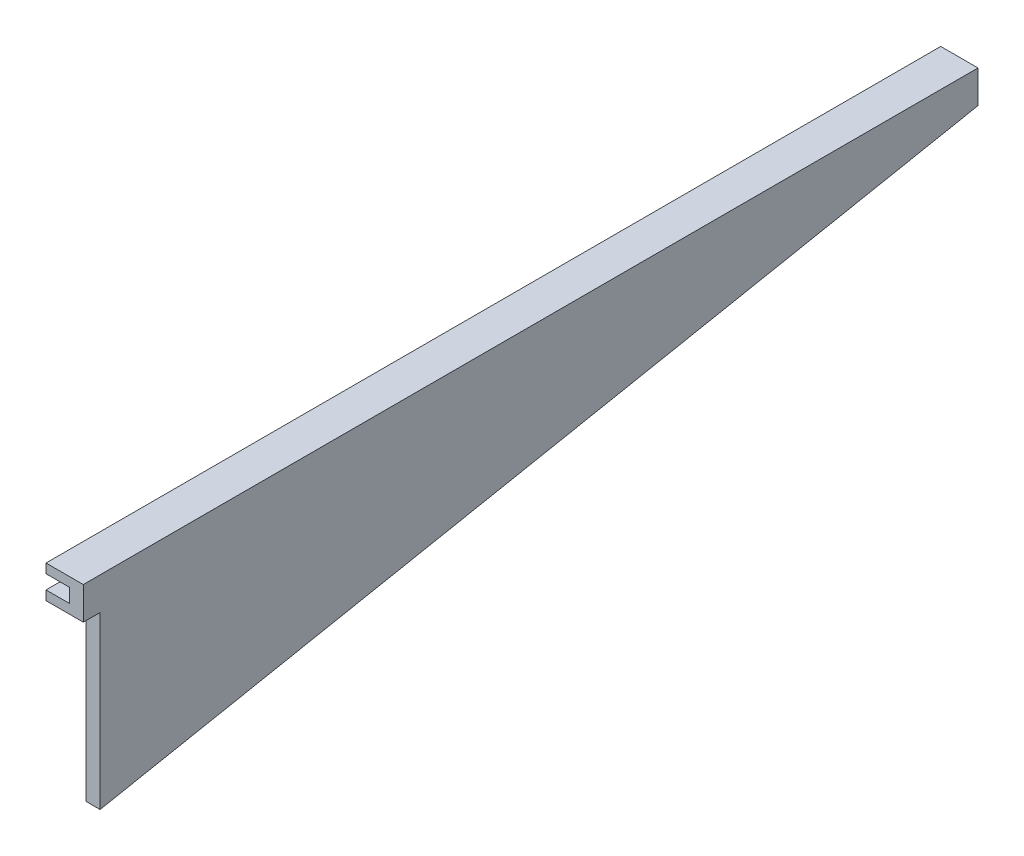
ISO-10303-21;
HEADER;
FILE_DESCRIPTION(('STEP AP214'),'2;1');
FILE_NAME('part.step','',(''),(''),'','','');
FILE_SCHEMA(('AUTOMOTIVE_DESIGN { 1 0 10303 214 1 1 1 1 }'));
ENDSEC;
DATA;
#1=APPLICATION_CONTEXT('core data for automotive mechanical design processes');
#2=APPLICATION_PROTOCOL_DEFINITION('international standard','automotive_design',2000,#1);
#3=PRODUCT_CONTEXT('',#1,'mechanical');
#4=PRODUCT('Part','Part','',(#3));
#5=PRODUCT_RELATED_PRODUCT_CATEGORY('part','',(#4));
#6=PRODUCT_DEFINITION_FORMATION('','',#4);
#7=PRODUCT_DEFINITION_CONTEXT('part definition',#1,'design');
#8=PRODUCT_DEFINITION('design','',#6,#7);
#9=PRODUCT_DEFINITION_SHAPE('','',#8);
#10=(LENGTH_UNIT() NAMED_UNIT(*) SI_UNIT(.MILLI.,.METRE.));
#11=(NAMED_UNIT(*) PLANE_ANGLE_UNIT() SI_UNIT($,.RADIAN.));
#12=(NAMED_UNIT(*) SI_UNIT($,.STERADIAN.) SOLID_ANGLE_UNIT());
#13=UNCERTAINTY_MEASURE_WITH_UNIT(LENGTH_MEASURE(1.E-05),#10,'distance_accuracy_value','');
#14=(GEOMETRIC_REPRESENTATION_CONTEXT(3) GLOBAL_UNCERTAINTY_ASSIGNED_CONTEXT((#13)) GLOBAL_UNIT_ASSIGNED_CONTEXT((#10,
#11,#12)) REPRESENTATION_CONTEXT('',''));
#15=CARTESIAN_POINT('',(0.,0.,0.));
#16=DIRECTION('',(0.,0.,1.));
#17=DIRECTION('',(1.,0.,0.));
#18=AXIS2_PLACEMENT_3D('',#15,#16,#17);
#19=CARTESIAN_POINT('',(-4.,-3.5,192.));
#20=DIRECTION('',(1.,0.,0.));
#21=DIRECTION('',(0.,0.,-1.));
#22=AXIS2_PLACEMENT_3D('',#19,#20,#21);
#23=PLANE('',#22);
#24=DIRECTION('',(0.,-1.,0.));
#25=VECTOR('',#24,1.);
#26=CARTESIAN_POINT('',(-4.,-3.5,0.));
#27=LINE('',#26,#25);
#28=CARTESIAN_POINT('',(-4.,3.5,0.));
#29=VERTEX_POINT('',#28);
#30=CARTESIAN_POINT('',(-4.,1.5,0.));
#31=VERTEX_POINT('',#30);
#32=EDGE_CURVE('E120',#29,#31,#27,.T.);
#33=ORIENTED_EDGE('',*,*,#32,.T.);
#34=DIRECTION('',(0.,0.,1.));
#35=VECTOR('',#34,1.);
#36=CARTESIAN_POINT('',(-4.,1.5,0.));
#37=LINE('',#36,#35);
#38=CARTESIAN_POINT('',(-4.,1.5,192.));
#39=VERTEX_POINT('',#38);
#40=EDGE_CURVE('E179',#31,#39,#37,.T.);
#41=ORIENTED_EDGE('',*,*,#40,.T.);
#42=DIRECTION('',(0.,-1.,0.));
#43=VECTOR('',#42,1.);
#44=CARTESIAN_POINT('',(-4.,-3.5,192.));
#45=LINE('',#44,#43);
#46=CARTESIAN_POINT('',(-4.,3.5,192.));
#47=VERTEX_POINT('',#46);
#48=EDGE_CURVE('E188',#47,#39,#45,.T.);
#49=ORIENTED_EDGE('',*,*,#48,.F.);
#50=DIRECTION('',(0.,0.,-1.));
#51=VECTOR('',#50,1.);
#52=CARTESIAN_POINT('',(-4.,3.5,192.));
#53=LINE('',#52,#51);
#54=EDGE_CURVE('E41',#47,#29,#53,.T.);
#55=ORIENTED_EDGE('',*,*,#54,.T.);
#56=EDGE_LOOP('',(#33,#41,#49,#55));
#57=FACE_BOUND('',#56,.T.);
#58=ADVANCED_FACE('F33',(#57),#23,.F.);
#59=CARTESIAN_POINT('',(-4.,-1.5,192.));
#60=VERTEX_POINT('',#59);
#61=CARTESIAN_POINT('',(-4.,-3.5,192.));
#62=VERTEX_POINT('',#61);
#63=EDGE_CURVE('E124',#60,#62,#45,.T.);
#64=ORIENTED_EDGE('',*,*,#63,.F.);
#65=DIRECTION('',(0.,0.,1.));
#66=VECTOR('',#65,1.);
#67=CARTESIAN_POINT('',(-4.,-1.5,0.));
#68=LINE('',#67,#66);
#69=CARTESIAN_POINT('',(-4.,-1.5,0.));
#70=VERTEX_POINT('',#69);
#71=EDGE_CURVE('E172',#70,#60,#68,.T.);
#72=ORIENTED_EDGE('',*,*,#71,.F.);
#73=CARTESIAN_POINT('',(-4.,-3.5,0.));
#74=VERTEX_POINT('',#73);
#75=EDGE_CURVE('E182',#70,#74,#27,.T.);
#76=ORIENTED_EDGE('',*,*,#75,.T.);
#77=DIRECTION('',(0.,0.,-1.));
#78=VECTOR('',#77,1.);
#79=CARTESIAN_POINT('',(-4.,-3.5,192.));
#80=LINE('',#79,#78);
#81=EDGE_CURVE('E11',#62,#74,#80,.T.);
#82=ORIENTED_EDGE('',*,*,#81,.F.);
#83=EDGE_LOOP('',(#64,#72,#76,#82));
#84=FACE_BOUND('',#83,.T.);
#85=ADVANCED_FACE('F35',(#84),#23,.F.);
#86=CARTESIAN_POINT('',(4.,-3.5,192.));
#87=DIRECTION('',(0.,1.,0.));
#88=DIRECTION('',(0.,0.,1.));
#89=AXIS2_PLACEMENT_3D('',#86,#87,#88);
#90=PLANE('',#89);
#91=DIRECTION('',(0.,0.,-1.));
#92=VECTOR('',#91,1.);
#93=CARTESIAN_POINT('',(4.001,-3.5,192.));
#94=LINE('',#93,#92);
#95=CARTESIAN_POINT('',(4.001,-3.5,192.));
#96=VERTEX_POINT('',#95);
#97=CARTESIAN_POINT('',(4.001,-3.5,188.401251415985));
#98=VERTEX_POINT('',#97);
#99=EDGE_CURVE('E144',#96,#98,#94,.T.);
#100=ORIENTED_EDGE('',*,*,#99,.F.);
#101=DIRECTION('',(1.,0.,0.));
#102=VECTOR('',#101,1.);
#103=CARTESIAN_POINT('',(4.,-3.5,192.));
#104=LINE('',#103,#102);
#105=EDGE_CURVE('E191',#62,#96,#104,.T.);
#106=ORIENTED_EDGE('',*,*,#105,.F.);
#107=ORIENTED_EDGE('',*,*,#81,.T.);
#108=DIRECTION('',(1.,0.,0.));
#109=VECTOR('',#108,1.);
#110=CARTESIAN_POINT('',(4.,-3.5,0.));
#111=LINE('',#110,#109);
#112=CARTESIAN_POINT('',(0.999999999999999,-3.5,0.));
#113=VERTEX_POINT('',#112);
#114=EDGE_CURVE('E125',#74,#113,#111,.T.);
#115=ORIENTED_EDGE('',*,*,#114,.T.);
#116=DIRECTION('',(0.,0.,-1.));
#117=VECTOR('',#116,1.);
#118=CARTESIAN_POINT('',(0.999999999999999,-3.5,192.));
#119=LINE('',#118,#117);
#120=CARTESIAN_POINT('',(0.999999999999999,-3.5,188.401251415985));
#121=VERTEX_POINT('',#120);
#122=EDGE_CURVE('E156',#121,#113,#119,.T.);
#123=ORIENTED_EDGE('',*,*,#122,.F.);
#124=DIRECTION('',(1.,0.,0.));
#125=VECTOR('',#124,1.);
#126=CARTESIAN_POINT('',(0.999999999999999,-3.5,188.401251415985));
#127=LINE('',#126,#125);
#128=EDGE_CURVE('E48',#121,#98,#127,.T.);
#129=ORIENTED_EDGE('',*,*,#128,.T.);
#130=EDGE_LOOP('',(#100,#106,#107,#115,#123,#129));
#131=FACE_BOUND('',#130,.T.);
#132=ADVANCED_FACE('F204',(#131),#90,.F.);
#133=CARTESIAN_POINT('',(4.,3.5,192.));
#134=DIRECTION('',(0.,-1.,0.));
#135=DIRECTION('',(0.,0.,-1.));
#136=AXIS2_PLACEMENT_3D('',#133,#134,#135);
#137=PLANE('',#136);
#138=DIRECTION('',(-1.,0.,0.));
#139=VECTOR('',#138,1.);
#140=CARTESIAN_POINT('',(4.,3.5,0.));
#141=LINE('',#140,#139);
#142=CARTESIAN_POINT('',(4.001,3.5,0.));
#143=VERTEX_POINT('',#142);
#144=EDGE_CURVE('E113',#143,#29,#141,.T.);
#145=ORIENTED_EDGE('',*,*,#144,.T.);
#146=ORIENTED_EDGE('',*,*,#54,.F.);
#147=DIRECTION('',(-1.,0.,0.));
#148=VECTOR('',#147,1.);
#149=CARTESIAN_POINT('',(4.,3.5,192.));
#150=LINE('',#149,#148);
#151=CARTESIAN_POINT('',(4.001,3.5,192.));
#152=VERTEX_POINT('',#151);
#153=EDGE_CURVE('E130',#152,#47,#150,.T.);
#154=ORIENTED_EDGE('',*,*,#153,.F.);
#155=DIRECTION('',(0.,0.,1.));
#156=VECTOR('',#155,1.);
#157=CARTESIAN_POINT('',(4.001,3.5,0.));
#158=LINE('',#157,#156);
#159=EDGE_CURVE('E128',#143,#152,#158,.T.);
#160=ORIENTED_EDGE('',*,*,#159,.F.);
#161=EDGE_LOOP('',(#145,#146,#154,#160));
#162=FACE_BOUND('',#161,.T.);
#163=ADVANCED_FACE('F129',(#162),#137,.F.);
#164=CARTESIAN_POINT('',(0.,0.,192.));
#165=DIRECTION('',(0.,0.,1.));
#166=DIRECTION('',(1.,0.,0.));
#167=AXIS2_PLACEMENT_3D('',#164,#165,#166);
#168=PLANE('',#167);
#169=DIRECTION('',(0.,1.,0.));
#170=VECTOR('',#169,1.);
#171=CARTESIAN_POINT('',(0.999999999999999,1.5,192.));
#172=LINE('',#171,#170);
#173=CARTESIAN_POINT('',(0.999999999999999,-1.5,192.));
#174=VERTEX_POINT('',#173);
#175=CARTESIAN_POINT('',(0.999999999999999,1.5,192.));
#176=VERTEX_POINT('',#175);
#177=EDGE_CURVE('E175',#174,#176,#172,.T.);
#178=ORIENTED_EDGE('',*,*,#177,.F.);
#179=DIRECTION('',(1.,0.,0.));
#180=VECTOR('',#179,1.);
#181=CARTESIAN_POINT('',(-4.,-1.5,192.));
#182=LINE('',#181,#180);
#183=EDGE_CURVE('E162',#60,#174,#182,.T.);
#184=ORIENTED_EDGE('',*,*,#183,.F.);
#185=ORIENTED_EDGE('',*,*,#63,.T.);
#186=ORIENTED_EDGE('',*,*,#105,.T.);
#187=DIRECTION('',(0.,-1.,0.));
#188=VECTOR('',#187,1.);
#189=CARTESIAN_POINT('',(4.001,3.5,192.));
#190=LINE('',#189,#188);
#191=EDGE_CURVE('E134',#152,#96,#190,.T.);
#192=ORIENTED_EDGE('',*,*,#191,.F.);
#193=ORIENTED_EDGE('',*,*,#153,.T.);
#194=ORIENTED_EDGE('',*,*,#48,.T.);
#195=DIRECTION('',(-1.,0.,0.));
#196=VECTOR('',#195,1.);
#197=CARTESIAN_POINT('',(-4.,1.5,192.));
#198=LINE('',#197,#196);
#199=EDGE_CURVE('E167',#176,#39,#198,.T.);
#200=ORIENTED_EDGE('',*,*,#199,.F.);
#201=EDGE_LOOP('',(#178,#184,#185,#186,#192,#193,#194,#200));
#202=FACE_BOUND('',#201,.T.);
#203=ADVANCED_FACE('F200',(#202),#168,.T.);
#204=CARTESIAN_POINT('',(0.,0.,0.));
#205=DIRECTION('',(0.,0.,1.));
#206=DIRECTION('',(1.,0.,0.));
#207=AXIS2_PLACEMENT_3D('',#204,#205,#206);
#208=PLANE('',#207);
#209=DIRECTION('',(1.,0.,0.));
#210=VECTOR('',#209,1.);
#211=CARTESIAN_POINT('',(0.999999999999999,-3.5,0.));
#212=LINE('',#211,#210);
#213=CARTESIAN_POINT('',(4.001,-3.5,0.));
#214=VERTEX_POINT('',#213);
#215=EDGE_CURVE('E56',#113,#214,#212,.T.);
#216=ORIENTED_EDGE('',*,*,#215,.F.);
#217=ORIENTED_EDGE('',*,*,#114,.F.);
#218=ORIENTED_EDGE('',*,*,#75,.F.);
#219=DIRECTION('',(1.,0.,0.));
#220=VECTOR('',#219,1.);
#221=CARTESIAN_POINT('',(-4.,-1.5,0.));
#222=LINE('',#221,#220);
#223=CARTESIAN_POINT('',(0.999999999999999,-1.5,0.));
#224=VERTEX_POINT('',#223);
#225=EDGE_CURVE('E163',#70,#224,#222,.T.);
#226=ORIENTED_EDGE('',*,*,#225,.T.);
#227=DIRECTION('',(0.,1.,0.));
#228=VECTOR('',#227,1.);
#229=CARTESIAN_POINT('',(0.999999999999999,1.5,0.));
#230=LINE('',#229,#228);
#231=CARTESIAN_POINT('',(0.999999999999999,1.5,0.));
#232=VERTEX_POINT('',#231);
#233=EDGE_CURVE('E166',#224,#232,#230,.T.);
#234=ORIENTED_EDGE('',*,*,#233,.T.);
#235=DIRECTION('',(-1.,0.,0.));
#236=VECTOR('',#235,1.);
#237=CARTESIAN_POINT('',(-4.,1.5,0.));
#238=LINE('',#237,#236);
#239=EDGE_CURVE('E170',#232,#31,#238,.T.);
#240=ORIENTED_EDGE('',*,*,#239,.T.);
#241=ORIENTED_EDGE('',*,*,#32,.F.);
#242=ORIENTED_EDGE('',*,*,#144,.F.);
#243=DIRECTION('',(0.,1.,0.));
#244=VECTOR('',#243,1.);
#245=CARTESIAN_POINT('',(4.001,-3.5,0.));
#246=LINE('',#245,#244);
#247=EDGE_CURVE('E117',#214,#143,#246,.T.);
#248=ORIENTED_EDGE('',*,*,#247,.F.);
#249=EDGE_LOOP('',(#216,#217,#218,#226,#234,#240,#241,#242,#248));
#250=FACE_BOUND('',#249,.T.);
#251=ADVANCED_FACE('F115',(#250),#208,.F.);
#252=CARTESIAN_POINT('',(-4.,1.5,0.));
#253=DIRECTION('',(0.,1.,0.));
#254=DIRECTION('',(0.,0.,1.));
#255=AXIS2_PLACEMENT_3D('',#252,#253,#254);
#256=PLANE('',#255);
#257=ORIENTED_EDGE('',*,*,#199,.T.);
#258=ORIENTED_EDGE('',*,*,#40,.F.);
#259=ORIENTED_EDGE('',*,*,#239,.F.);
#260=DIRECTION('',(0.,0.,1.));
#261=VECTOR('',#260,1.);
#262=CARTESIAN_POINT('',(0.999999999999999,1.5,0.));
#263=LINE('',#262,#261);
#264=EDGE_CURVE('E183',#232,#176,#263,.T.);
#265=ORIENTED_EDGE('',*,*,#264,.T.);
#266=EDGE_LOOP('',(#257,#258,#259,#265));
#267=FACE_BOUND('',#266,.T.);
#268=ADVANCED_FACE('F241',(#267),#256,.F.);
#269=CARTESIAN_POINT('',(0.999999999999999,1.5,0.));
#270=DIRECTION('',(1.,0.,0.));
#271=DIRECTION('',(0.,1.,0.));
#272=AXIS2_PLACEMENT_3D('',#269,#270,#271);
#273=PLANE('',#272);
#274=ORIENTED_EDGE('',*,*,#177,.T.);
#275=ORIENTED_EDGE('',*,*,#264,.F.);
#276=ORIENTED_EDGE('',*,*,#233,.F.);
#277=DIRECTION('',(0.,0.,1.));
#278=VECTOR('',#277,1.);
#279=CARTESIAN_POINT('',(0.999999999999999,-1.5,0.));
#280=LINE('',#279,#278);
#281=EDGE_CURVE('E185',#224,#174,#280,.T.);
#282=ORIENTED_EDGE('',*,*,#281,.T.);
#283=EDGE_LOOP('',(#274,#275,#276,#282));
#284=FACE_BOUND('',#283,.T.);
#285=ADVANCED_FACE('F239',(#284),#273,.F.);
#286=CARTESIAN_POINT('',(-4.,-1.5,0.));
#287=DIRECTION('',(0.,-1.,0.));
#288=DIRECTION('',(0.,0.,-1.));
#289=AXIS2_PLACEMENT_3D('',#286,#287,#288);
#290=PLANE('',#289);
#291=ORIENTED_EDGE('',*,*,#183,.T.);
#292=ORIENTED_EDGE('',*,*,#281,.F.);
#293=ORIENTED_EDGE('',*,*,#225,.F.);
#294=ORIENTED_EDGE('',*,*,#71,.T.);
#295=EDGE_LOOP('',(#291,#292,#293,#294));
#296=FACE_BOUND('',#295,.T.);
#297=ADVANCED_FACE('F220',(#296),#290,.F.);
#298=CARTESIAN_POINT('',(0.999999999999999,0.,0.));
#299=DIRECTION('',(1.,0.,0.));
#300=DIRECTION('',(0.,0.,-1.));
#301=AXIS2_PLACEMENT_3D('',#298,#299,#300);
#302=PLANE('',#301);
#303=DIRECTION('',(0.,-1.,0.));
#304=VECTOR('',#303,1.);
#305=CARTESIAN_POINT('',(0.999999999999999,-40.1214934921709,188.401251415985));
#306=LINE('',#305,#304);
#307=CARTESIAN_POINT('',(0.999999999999999,-40.1214934921709,188.401251415985));
#308=VERTEX_POINT('',#307);
#309=EDGE_CURVE('E150',#121,#308,#306,.T.);
#310=ORIENTED_EDGE('',*,*,#309,.F.);
#311=ORIENTED_EDGE('',*,*,#122,.T.);
#312=DIRECTION('',(0.,0.190808995376539,-0.981627183447665));
#313=VECTOR('',#312,1.);
#314=CARTESIAN_POINT('',(0.999999999999999,-3.5,0.));
#315=LINE('',#314,#313);
#316=EDGE_CURVE('E152',#308,#113,#315,.T.);
#317=ORIENTED_EDGE('',*,*,#316,.F.);
#318=EDGE_LOOP('',(#310,#311,#317));
#319=FACE_BOUND('',#318,.T.);
#320=ADVANCED_FACE('F209',(#319),#302,.F.);
#321=CARTESIAN_POINT('',(0.999999999999999,-3.5,0.));
#322=DIRECTION('',(0.,-0.981627183447665,-0.190808995376538));
#323=DIRECTION('',(0.,0.190808995376539,-0.981627183447665));
#324=AXIS2_PLACEMENT_3D('',#321,#322,#323);
#325=PLANE('',#324);
#326=ORIENTED_EDGE('',*,*,#215,.T.);
#327=DIRECTION('',(0.,0.190808995376539,-0.981627183447665));
#328=VECTOR('',#327,1.);
#329=CARTESIAN_POINT('',(4.001,-3.5,0.));
#330=LINE('',#329,#328);
#331=CARTESIAN_POINT('',(4.001,-40.1214934921709,188.401251415985));
#332=VERTEX_POINT('',#331);
#333=EDGE_CURVE('E140',#332,#214,#330,.T.);
#334=ORIENTED_EDGE('',*,*,#333,.F.);
#335=DIRECTION('',(1.,0.,0.));
#336=VECTOR('',#335,1.);
#337=CARTESIAN_POINT('',(0.999999999999999,-40.1214934921709,188.401251415985));
#338=LINE('',#337,#336);
#339=EDGE_CURVE('E157',#308,#332,#338,.T.);
#340=ORIENTED_EDGE('',*,*,#339,.F.);
#341=ORIENTED_EDGE('',*,*,#316,.T.);
#342=EDGE_LOOP('',(#326,#334,#340,#341));
#343=FACE_BOUND('',#342,.T.);
#344=ADVANCED_FACE('F212',(#343),#325,.T.);
#345=CARTESIAN_POINT('',(0.999999999999999,-40.1214934921709,188.401251415985));
#346=DIRECTION('',(0.,0.,1.));
#347=DIRECTION('',(1.,0.,0.));
#348=AXIS2_PLACEMENT_3D('',#345,#346,#347);
#349=PLANE('',#348);
#350=ORIENTED_EDGE('',*,*,#339,.T.);
#351=DIRECTION('',(0.,-1.,0.));
#352=VECTOR('',#351,1.);
#353=CARTESIAN_POINT('',(4.001,-40.1214934921709,188.401251415985));
#354=LINE('',#353,#352);
#355=EDGE_CURVE('E147',#98,#332,#354,.T.);
#356=ORIENTED_EDGE('',*,*,#355,.F.);
#357=ORIENTED_EDGE('',*,*,#128,.F.);
#358=ORIENTED_EDGE('',*,*,#309,.T.);
#359=EDGE_LOOP('',(#350,#356,#357,#358));
#360=FACE_BOUND('',#359,.T.);
#361=ADVANCED_FACE('F210',(#360),#349,.T.);
#362=CARTESIAN_POINT('',(4.001,0.,0.));
#363=DIRECTION('',(1.,0.,0.));
#364=DIRECTION('',(0.,0.,-1.));
#365=AXIS2_PLACEMENT_3D('',#362,#363,#364);
#366=PLANE('',#365);
#367=ORIENTED_EDGE('',*,*,#247,.T.);
#368=ORIENTED_EDGE('',*,*,#159,.T.);
#369=ORIENTED_EDGE('',*,*,#191,.T.);
#370=ORIENTED_EDGE('',*,*,#99,.T.);
#371=ORIENTED_EDGE('',*,*,#355,.T.);
#372=ORIENTED_EDGE('',*,*,#333,.T.);
#373=EDGE_LOOP('',(#367,#368,#369,#370,#371,#372));
#374=FACE_BOUND('',#373,.T.);
#375=ADVANCED_FACE('F137',(#374),#366,.T.);
#376=CLOSED_SHELL('',(#58,#85,#132,#163,#203,#251,#268,#285,#297,#320,#344,#361,#375));
#377=MANIFOLD_SOLID_BREP('B2',#376);
#378=ADVANCED_BREP_SHAPE_REPRESENTATION('',(#18,#377),#14);
#379=SHAPE_DEFINITION_REPRESENTATION(#9,#378);
ENDSEC;
END-ISO-10303-21;
